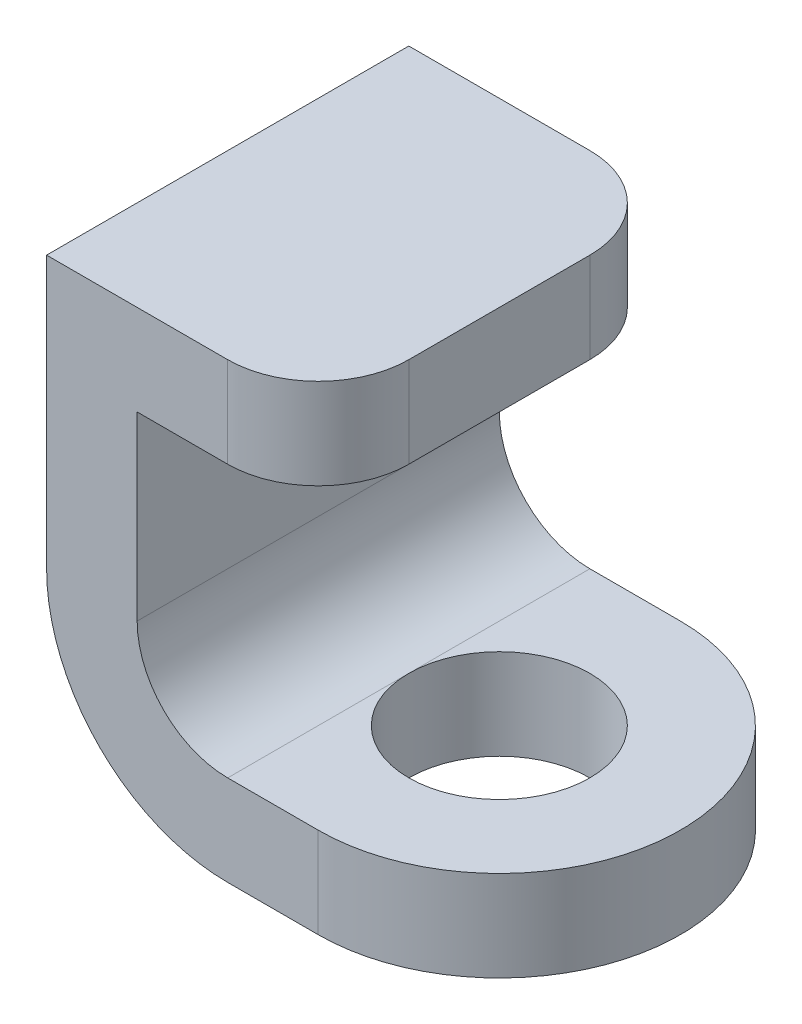
ISO-10303-21;
HEADER;
FILE_DESCRIPTION(('STEP AP214'),'2;1');
FILE_NAME('part.step','',(''),(''),'','','');
FILE_SCHEMA(('AUTOMOTIVE_DESIGN { 1 0 10303 214 1 1 1 1 }'));
ENDSEC;
DATA;
#1=APPLICATION_CONTEXT('core data for automotive mechanical design processes');
#2=APPLICATION_PROTOCOL_DEFINITION('international standard','automotive_design',2000,#1);
#3=PRODUCT_CONTEXT('',#1,'mechanical');
#4=PRODUCT('Part','Part','',(#3));
#5=PRODUCT_RELATED_PRODUCT_CATEGORY('part','',(#4));
#6=PRODUCT_DEFINITION_FORMATION('','',#4);
#7=PRODUCT_DEFINITION_CONTEXT('part definition',#1,'design');
#8=PRODUCT_DEFINITION('design','',#6,#7);
#9=PRODUCT_DEFINITION_SHAPE('','',#8);
#10=(LENGTH_UNIT() NAMED_UNIT(*) SI_UNIT(.MILLI.,.METRE.));
#11=(NAMED_UNIT(*) PLANE_ANGLE_UNIT() SI_UNIT($,.RADIAN.));
#12=(NAMED_UNIT(*) SI_UNIT($,.STERADIAN.) SOLID_ANGLE_UNIT());
#13=UNCERTAINTY_MEASURE_WITH_UNIT(LENGTH_MEASURE(1.E-05),#10,'distance_accuracy_value','');
#14=(GEOMETRIC_REPRESENTATION_CONTEXT(3) GLOBAL_UNCERTAINTY_ASSIGNED_CONTEXT((#13)) GLOBAL_UNIT_ASSIGNED_CONTEXT((#10,
#11,#12)) REPRESENTATION_CONTEXT('',''));
#15=CARTESIAN_POINT('',(0.,0.,0.));
#16=DIRECTION('',(0.,0.,1.));
#17=DIRECTION('',(1.,0.,0.));
#18=AXIS2_PLACEMENT_3D('',#15,#16,#17);
#19=CARTESIAN_POINT('',(-7.53303964757696,-21.1453744493392,40.));
#20=DIRECTION('',(0.,1.,0.));
#21=DIRECTION('',(0.,0.,1.));
#22=AXIS2_PLACEMENT_3D('',#19,#20,#21);
#23=PLANE('',#22);
#24=CARTESIAN_POINT('',(2.46696035242291,-21.1453744493392,20.));
#25=DIRECTION('',(0.,-1.,0.));
#26=DIRECTION('',(0.,0.,-1.));
#27=AXIS2_PLACEMENT_3D('',#24,#25,#26);
#28=CIRCLE('',#27,20.);
#29=CARTESIAN_POINT('',(2.46696035242291,-21.1453744493392,0.));
#30=VERTEX_POINT('',#29);
#31=CARTESIAN_POINT('',(2.46696035242291,-21.1453744493392,40.));
#32=VERTEX_POINT('',#31);
#33=EDGE_CURVE('E135',#30,#32,#28,.T.);
#34=ORIENTED_EDGE('',*,*,#33,.T.);
#35=DIRECTION('',(1.,0.,0.));
#36=VECTOR('',#35,1.);
#37=CARTESIAN_POINT('',(-7.53303964757696,-21.1453744493392,40.));
#38=LINE('',#37,#36);
#39=CARTESIAN_POINT('',(-7.53303964757695,-21.1453744493392,40.));
#40=VERTEX_POINT('',#39);
#41=EDGE_CURVE('E139',#40,#32,#38,.T.);
#42=ORIENTED_EDGE('',*,*,#41,.F.);
#43=DIRECTION('',(0.,0.,-1.));
#44=VECTOR('',#43,1.);
#45=CARTESIAN_POINT('',(-7.53303964757695,-21.1453744493392,40.));
#46=LINE('',#45,#44);
#47=CARTESIAN_POINT('',(-7.53303964757695,-21.1453744493392,20.));
#48=VERTEX_POINT('',#47);
#49=EDGE_CURVE('E224',#40,#48,#46,.T.);
#50=ORIENTED_EDGE('',*,*,#49,.T.);
#51=CARTESIAN_POINT('',(2.46696035242291,-21.1453744493392,20.));
#52=DIRECTION('',(0.,-1.,0.));
#53=DIRECTION('',(0.,0.,-1.));
#54=AXIS2_PLACEMENT_3D('',#51,#52,#53);
#55=CIRCLE('',#54,10.);
#56=EDGE_CURVE('E55',#48,#48,#55,.T.);
#57=ORIENTED_EDGE('',*,*,#56,.F.);
#58=CARTESIAN_POINT('',(-7.53303964757695,-21.1453744493392,0.));
#59=VERTEX_POINT('',#58);
#60=EDGE_CURVE('E223',#48,#59,#46,.T.);
#61=ORIENTED_EDGE('',*,*,#60,.T.);
#62=DIRECTION('',(1.,0.,0.));
#63=VECTOR('',#62,1.);
#64=CARTESIAN_POINT('',(-7.53303964757696,-21.1453744493392,0.));
#65=LINE('',#64,#63);
#66=EDGE_CURVE('E141',#59,#30,#65,.T.);
#67=ORIENTED_EDGE('',*,*,#66,.T.);
#68=EDGE_LOOP('',(#34,#42,#50,#57,#61,#67));
#69=FACE_BOUND('',#68,.T.);
#70=ADVANCED_FACE('F41',(#69),#23,.F.);
#71=CARTESIAN_POINT('',(22.4669603524229,-11.1453744493392,40.));
#72=DIRECTION('',(0.,-1.,0.));
#73=DIRECTION('',(1.,0.,0.));
#74=AXIS2_PLACEMENT_3D('',#71,#72,#73);
#75=PLANE('',#74);
#76=DIRECTION('',(-1.,0.,0.));
#77=VECTOR('',#76,1.);
#78=CARTESIAN_POINT('',(22.4669603524229,-11.1453744493392,40.));
#79=LINE('',#78,#77);
#80=CARTESIAN_POINT('',(2.46696035242291,-11.1453744493392,40.));
#81=VERTEX_POINT('',#80);
#82=CARTESIAN_POINT('',(-7.53303964757703,-11.1453744493392,40.));
#83=VERTEX_POINT('',#82);
#84=EDGE_CURVE('E159',#81,#83,#79,.T.);
#85=ORIENTED_EDGE('',*,*,#84,.F.);
#86=CARTESIAN_POINT('',(2.46696035242291,-11.1453744493392,20.));
#87=DIRECTION('',(0.,-1.,0.));
#88=DIRECTION('',(1.,0.,0.));
#89=AXIS2_PLACEMENT_3D('',#86,#87,#88);
#90=CIRCLE('',#89,20.);
#91=CARTESIAN_POINT('',(2.46696035242291,-11.1453744493392,0.));
#92=VERTEX_POINT('',#91);
#93=EDGE_CURVE('E149',#92,#81,#90,.T.);
#94=ORIENTED_EDGE('',*,*,#93,.F.);
#95=DIRECTION('',(-1.,0.,0.));
#96=VECTOR('',#95,1.);
#97=CARTESIAN_POINT('',(22.4669603524229,-11.1453744493392,0.));
#98=LINE('',#97,#96);
#99=CARTESIAN_POINT('',(-7.53303964757703,-11.1453744493392,0.));
#100=VERTEX_POINT('',#99);
#101=EDGE_CURVE('E192',#92,#100,#98,.T.);
#102=ORIENTED_EDGE('',*,*,#101,.T.);
#103=DIRECTION('',(0.,0.,-1.));
#104=VECTOR('',#103,1.);
#105=CARTESIAN_POINT('',(-7.53303964757703,-11.1453744493392,40.));
#106=LINE('',#105,#104);
#107=CARTESIAN_POINT('',(-7.53303964757703,-11.1453744493392,20.));
#108=VERTEX_POINT('',#107);
#109=EDGE_CURVE('E218',#108,#100,#106,.T.);
#110=ORIENTED_EDGE('',*,*,#109,.F.);
#111=CARTESIAN_POINT('',(2.46696035242291,-11.1453744493392,20.));
#112=DIRECTION('',(0.,-1.,0.));
#113=DIRECTION('',(1.,0.,0.));
#114=AXIS2_PLACEMENT_3D('',#111,#112,#113);
#115=CIRCLE('',#114,10.);
#116=EDGE_CURVE('E60',#108,#108,#115,.T.);
#117=ORIENTED_EDGE('',*,*,#116,.T.);
#118=EDGE_CURVE('E219',#83,#108,#106,.T.);
#119=ORIENTED_EDGE('',*,*,#118,.F.);
#120=EDGE_LOOP('',(#85,#94,#102,#110,#117,#119));
#121=FACE_BOUND('',#120,.T.);
#122=ADVANCED_FACE('F284',(#121),#75,.F.);
#123=CARTESIAN_POINT('',(-7.5330396475771,-1.14537444933921,40.));
#124=DIRECTION('',(0.,0.,-1.));
#125=DIRECTION('',(-1.,0.,0.));
#126=AXIS2_PLACEMENT_3D('',#123,#124,#125);
#127=PLANE('',#126);
#128=DIRECTION('',(0.,1.,0.));
#129=VECTOR('',#128,1.);
#130=CARTESIAN_POINT('',(-17.5330396475771,-1.14537444933914,40.));
#131=LINE('',#130,#129);
#132=CARTESIAN_POINT('',(-17.5330396475771,-1.14537444933921,40.));
#133=VERTEX_POINT('',#132);
#134=CARTESIAN_POINT('',(-17.5330396475771,18.8546255506608,40.));
#135=VERTEX_POINT('',#134);
#136=EDGE_CURVE('E171',#133,#135,#131,.T.);
#137=ORIENTED_EDGE('',*,*,#136,.T.);
#138=DIRECTION('',(1.,0.,0.));
#139=VECTOR('',#138,1.);
#140=CARTESIAN_POINT('',(-17.5330396475771,18.8546255506608,40.));
#141=LINE('',#140,#139);
#142=CARTESIAN_POINT('',(-7.53303964757718,18.8546255506608,40.));
#143=VERTEX_POINT('',#142);
#144=EDGE_CURVE('E174',#135,#143,#141,.T.);
#145=ORIENTED_EDGE('',*,*,#144,.T.);
#146=DIRECTION('',(0.,1.,0.));
#147=VECTOR('',#146,1.);
#148=CARTESIAN_POINT('',(-7.5330396475771,-11.1453744493392,40.));
#149=LINE('',#148,#147);
#150=CARTESIAN_POINT('',(-7.5330396475771,28.8546255506608,40.));
#151=VERTEX_POINT('',#150);
#152=EDGE_CURVE('E50',#143,#151,#149,.T.);
#153=ORIENTED_EDGE('',*,*,#152,.T.);
#154=DIRECTION('',(-1.,0.,0.));
#155=VECTOR('',#154,1.);
#156=CARTESIAN_POINT('',(2.46696035242289,28.8546255506608,40.));
#157=LINE('',#156,#155);
#158=CARTESIAN_POINT('',(-27.5330396475771,28.8546255506608,40.));
#159=VERTEX_POINT('',#158);
#160=EDGE_CURVE('E206',#151,#159,#157,.T.);
#161=ORIENTED_EDGE('',*,*,#160,.T.);
#162=DIRECTION('',(0.,-1.,0.));
#163=VECTOR('',#162,1.);
#164=CARTESIAN_POINT('',(-27.5330396475771,28.8546255506608,40.));
#165=LINE('',#164,#163);
#166=CARTESIAN_POINT('',(-27.5330396475771,-1.14537444933907,40.));
#167=VERTEX_POINT('',#166);
#168=EDGE_CURVE('E165',#159,#167,#165,.T.);
#169=ORIENTED_EDGE('',*,*,#168,.T.);
#170=CARTESIAN_POINT('',(-7.5330396475771,-1.14537444933921,40.));
#171=DIRECTION('',(0.,0.,1.));
#172=DIRECTION('',(-1.,0.,0.));
#173=AXIS2_PLACEMENT_3D('',#170,#171,#172);
#174=CIRCLE('',#173,20.);
#175=EDGE_CURVE('E156',#167,#40,#174,.T.);
#176=ORIENTED_EDGE('',*,*,#175,.T.);
#177=ORIENTED_EDGE('',*,*,#41,.T.);
#178=DIRECTION('',(0.,-1.,0.));
#179=VECTOR('',#178,1.);
#180=CARTESIAN_POINT('',(2.46696035242291,18.8546255506608,40.));
#181=LINE('',#180,#179);
#182=EDGE_CURVE('E144',#81,#32,#181,.T.);
#183=ORIENTED_EDGE('',*,*,#182,.F.);
#184=ORIENTED_EDGE('',*,*,#84,.T.);
#185=CARTESIAN_POINT('',(-7.5330396475771,-1.14537444933921,40.));
#186=DIRECTION('',(0.,0.,-1.));
#187=DIRECTION('',(-1.,0.,0.));
#188=AXIS2_PLACEMENT_3D('',#185,#186,#187);
#189=CIRCLE('',#188,10.);
#190=EDGE_CURVE('E163',#83,#133,#189,.T.);
#191=ORIENTED_EDGE('',*,*,#190,.T.);
#192=EDGE_LOOP('',(#137,#145,#153,#161,#169,#176,#177,#183,#184,#191));
#193=FACE_BOUND('',#192,.T.);
#194=ADVANCED_FACE('F154',(#193),#127,.F.);
#195=CARTESIAN_POINT('',(-7.5330396475771,-1.14537444933921,0.));
#196=DIRECTION('',(0.,0.,-1.));
#197=DIRECTION('',(-1.,0.,0.));
#198=AXIS2_PLACEMENT_3D('',#195,#196,#197);
#199=PLANE('',#198);
#200=CARTESIAN_POINT('',(-7.5330396475771,-1.14537444933921,0.));
#201=DIRECTION('',(0.,0.,1.));
#202=DIRECTION('',(-1.,0.,0.));
#203=AXIS2_PLACEMENT_3D('',#200,#201,#202);
#204=CIRCLE('',#203,20.);
#205=CARTESIAN_POINT('',(-27.5330396475771,-1.14537444933907,0.));
#206=VERTEX_POINT('',#205);
#207=EDGE_CURVE('E186',#206,#59,#204,.T.);
#208=ORIENTED_EDGE('',*,*,#207,.F.);
#209=DIRECTION('',(0.,-1.,0.));
#210=VECTOR('',#209,1.);
#211=CARTESIAN_POINT('',(-27.5330396475771,28.8546255506608,0.));
#212=LINE('',#211,#210);
#213=CARTESIAN_POINT('',(-27.5330396475771,28.8546255506608,0.));
#214=VERTEX_POINT('',#213);
#215=EDGE_CURVE('E182',#214,#206,#212,.T.);
#216=ORIENTED_EDGE('',*,*,#215,.F.);
#217=DIRECTION('',(-1.,0.,0.));
#218=VECTOR('',#217,1.);
#219=CARTESIAN_POINT('',(2.46696035242289,28.8546255506608,0.));
#220=LINE('',#219,#218);
#221=CARTESIAN_POINT('',(-7.53303964757717,28.8546255506608,0.));
#222=VERTEX_POINT('',#221);
#223=EDGE_CURVE('E179',#222,#214,#220,.T.);
#224=ORIENTED_EDGE('',*,*,#223,.F.);
#225=DIRECTION('',(0.,1.,0.));
#226=VECTOR('',#225,1.);
#227=CARTESIAN_POINT('',(-7.5330396475771,-11.1453744493392,0.));
#228=LINE('',#227,#226);
#229=CARTESIAN_POINT('',(-7.5330396475771,18.8546255506608,0.));
#230=VERTEX_POINT('',#229);
#231=EDGE_CURVE('E239',#230,#222,#228,.T.);
#232=ORIENTED_EDGE('',*,*,#231,.F.);
#233=DIRECTION('',(1.,0.,0.));
#234=VECTOR('',#233,1.);
#235=CARTESIAN_POINT('',(-17.5330396475771,18.8546255506608,0.));
#236=LINE('',#235,#234);
#237=CARTESIAN_POINT('',(-17.5330396475771,18.8546255506608,0.));
#238=VERTEX_POINT('',#237);
#239=EDGE_CURVE('E202',#238,#230,#236,.T.);
#240=ORIENTED_EDGE('',*,*,#239,.F.);
#241=DIRECTION('',(0.,1.,0.));
#242=VECTOR('',#241,1.);
#243=CARTESIAN_POINT('',(-17.5330396475771,-1.14537444933914,0.));
#244=LINE('',#243,#242);
#245=CARTESIAN_POINT('',(-17.5330396475771,-1.14537444933921,0.));
#246=VERTEX_POINT('',#245);
#247=EDGE_CURVE('E199',#246,#238,#244,.T.);
#248=ORIENTED_EDGE('',*,*,#247,.F.);
#249=CARTESIAN_POINT('',(-7.5330396475771,-1.14537444933921,0.));
#250=DIRECTION('',(0.,0.,-1.));
#251=DIRECTION('',(-1.,0.,0.));
#252=AXIS2_PLACEMENT_3D('',#249,#250,#251);
#253=CIRCLE('',#252,10.);
#254=EDGE_CURVE('E196',#100,#246,#253,.T.);
#255=ORIENTED_EDGE('',*,*,#254,.F.);
#256=ORIENTED_EDGE('',*,*,#101,.F.);
#257=DIRECTION('',(0.,-1.,0.));
#258=VECTOR('',#257,1.);
#259=CARTESIAN_POINT('',(2.46696035242291,18.8546255506608,0.));
#260=LINE('',#259,#258);
#261=EDGE_CURVE('E12',#92,#30,#260,.T.);
#262=ORIENTED_EDGE('',*,*,#261,.T.);
#263=ORIENTED_EDGE('',*,*,#66,.F.);
#264=EDGE_LOOP('',(#208,#216,#224,#232,#240,#248,#255,#256,#262,#263));
#265=FACE_BOUND('',#264,.T.);
#266=ADVANCED_FACE('F296',(#265),#199,.T.);
#267=CARTESIAN_POINT('',(2.46696035242289,18.8546255506608,40.));
#268=DIRECTION('',(-1.,0.,0.));
#269=DIRECTION('',(0.,0.,1.));
#270=AXIS2_PLACEMENT_3D('',#267,#268,#269);
#271=PLANE('',#270);
#272=DIRECTION('',(0.,0.,-1.));
#273=VECTOR('',#272,1.);
#274=CARTESIAN_POINT('',(2.46696035242289,18.8546255506608,40.));
#275=LINE('',#274,#273);
#276=CARTESIAN_POINT('',(2.4669603524229,18.8546255506608,29.9999999999999));
#277=VERTEX_POINT('',#276);
#278=CARTESIAN_POINT('',(2.4669603524229,18.8546255506608,10.0000000000001));
#279=VERTEX_POINT('',#278);
#280=EDGE_CURVE('E178',#277,#279,#275,.T.);
#281=ORIENTED_EDGE('',*,*,#280,.T.);
#282=DIRECTION('',(0.,1.,0.));
#283=VECTOR('',#282,1.);
#284=CARTESIAN_POINT('',(2.4669603524229,-11.1453744493392,10.0000000000001));
#285=LINE('',#284,#283);
#286=CARTESIAN_POINT('',(2.46696035242289,28.8546255506608,10.0000000000001));
#287=VERTEX_POINT('',#286);
#288=EDGE_CURVE('E264',#279,#287,#285,.T.);
#289=ORIENTED_EDGE('',*,*,#288,.T.);
#290=DIRECTION('',(0.,0.,-1.));
#291=VECTOR('',#290,1.);
#292=CARTESIAN_POINT('',(2.46696035242289,28.8546255506608,40.));
#293=LINE('',#292,#291);
#294=CARTESIAN_POINT('',(2.46696035242289,28.8546255506608,29.9999999999999));
#295=VERTEX_POINT('',#294);
#296=EDGE_CURVE('E235',#295,#287,#293,.T.);
#297=ORIENTED_EDGE('',*,*,#296,.F.);
#298=DIRECTION('',(0.,1.,0.));
#299=VECTOR('',#298,1.);
#300=CARTESIAN_POINT('',(2.4669603524229,-11.1453744493392,29.9999999999999));
#301=LINE('',#300,#299);
#302=EDGE_CURVE('E265',#277,#295,#301,.T.);
#303=ORIENTED_EDGE('',*,*,#302,.F.);
#304=EDGE_LOOP('',(#281,#289,#297,#303));
#305=FACE_BOUND('',#304,.T.);
#306=ADVANCED_FACE('F43',(#305),#271,.F.);
#307=CARTESIAN_POINT('',(2.46696035242289,28.8546255506608,40.));
#308=DIRECTION('',(0.,-1.,0.));
#309=DIRECTION('',(1.,0.,0.));
#310=AXIS2_PLACEMENT_3D('',#307,#308,#309);
#311=PLANE('',#310);
#312=CARTESIAN_POINT('',(-7.5330396475771,28.8546255506608,10.));
#313=DIRECTION('',(0.,1.,0.));
#314=DIRECTION('',(-1.,0.,0.));
#315=AXIS2_PLACEMENT_3D('',#312,#313,#314);
#316=CIRCLE('',#315,10.);
#317=EDGE_CURVE('E268',#287,#222,#316,.T.);
#318=ORIENTED_EDGE('',*,*,#317,.T.);
#319=ORIENTED_EDGE('',*,*,#223,.T.);
#320=DIRECTION('',(0.,0.,-1.));
#321=VECTOR('',#320,1.);
#322=CARTESIAN_POINT('',(-27.5330396475771,28.8546255506608,40.));
#323=LINE('',#322,#321);
#324=EDGE_CURVE('E231',#159,#214,#323,.T.);
#325=ORIENTED_EDGE('',*,*,#324,.F.);
#326=ORIENTED_EDGE('',*,*,#160,.F.);
#327=CARTESIAN_POINT('',(-7.5330396475771,28.8546255506608,30.));
#328=DIRECTION('',(0.,1.,0.));
#329=DIRECTION('',(-1.,0.,0.));
#330=AXIS2_PLACEMENT_3D('',#327,#328,#329);
#331=CIRCLE('',#330,10.);
#332=EDGE_CURVE('E252',#151,#295,#331,.T.);
#333=ORIENTED_EDGE('',*,*,#332,.T.);
#334=ORIENTED_EDGE('',*,*,#296,.T.);
#335=EDGE_LOOP('',(#318,#319,#325,#326,#333,#334));
#336=FACE_BOUND('',#335,.T.);
#337=ADVANCED_FACE('F251',(#336),#311,.F.);
#338=CARTESIAN_POINT('',(-17.5330396475771,18.8546255506608,40.));
#339=DIRECTION('',(0.,1.,0.));
#340=DIRECTION('',(0.,0.,1.));
#341=AXIS2_PLACEMENT_3D('',#338,#339,#340);
#342=PLANE('',#341);
#343=CARTESIAN_POINT('',(-7.5330396475771,18.8546255506608,10.));
#344=DIRECTION('',(0.,1.,0.));
#345=DIRECTION('',(0.,0.,1.));
#346=AXIS2_PLACEMENT_3D('',#343,#344,#345);
#347=CIRCLE('',#346,10.);
#348=EDGE_CURVE('E261',#279,#230,#347,.T.);
#349=ORIENTED_EDGE('',*,*,#348,.F.);
#350=ORIENTED_EDGE('',*,*,#280,.F.);
#351=CARTESIAN_POINT('',(-7.5330396475771,18.8546255506608,30.));
#352=DIRECTION('',(0.,1.,0.));
#353=DIRECTION('',(0.,0.,1.));
#354=AXIS2_PLACEMENT_3D('',#351,#352,#353);
#355=CIRCLE('',#354,10.);
#356=EDGE_CURVE('E183',#143,#277,#355,.T.);
#357=ORIENTED_EDGE('',*,*,#356,.F.);
#358=ORIENTED_EDGE('',*,*,#144,.F.);
#359=DIRECTION('',(0.,0.,-1.));
#360=VECTOR('',#359,1.);
#361=CARTESIAN_POINT('',(-17.5330396475771,18.8546255506608,40.));
#362=LINE('',#361,#360);
#363=EDGE_CURVE('E210',#135,#238,#362,.T.);
#364=ORIENTED_EDGE('',*,*,#363,.T.);
#365=ORIENTED_EDGE('',*,*,#239,.T.);
#366=EDGE_LOOP('',(#349,#350,#357,#358,#364,#365));
#367=FACE_BOUND('',#366,.T.);
#368=ADVANCED_FACE('F303',(#367),#342,.F.);
#369=CARTESIAN_POINT('',(-27.5330396475771,28.8546255506608,40.));
#370=DIRECTION('',(1.,0.,0.));
#371=DIRECTION('',(0.,1.,0.));
#372=AXIS2_PLACEMENT_3D('',#369,#370,#371);
#373=PLANE('',#372);
#374=DIRECTION('',(0.,0.,-1.));
#375=VECTOR('',#374,1.);
#376=CARTESIAN_POINT('',(-27.5330396475771,-1.14537444933907,40.));
#377=LINE('',#376,#375);
#378=EDGE_CURVE('E227',#167,#206,#377,.T.);
#379=ORIENTED_EDGE('',*,*,#378,.F.);
#380=ORIENTED_EDGE('',*,*,#168,.F.);
#381=ORIENTED_EDGE('',*,*,#324,.T.);
#382=ORIENTED_EDGE('',*,*,#215,.T.);
#383=EDGE_LOOP('',(#379,#380,#381,#382));
#384=FACE_BOUND('',#383,.T.);
#385=ADVANCED_FACE('F314',(#384),#373,.F.);
#386=CARTESIAN_POINT('',(-7.5330396475771,-1.14537444933921,40.));
#387=DIRECTION('',(0.,0.,-1.));
#388=DIRECTION('',(-1.,0.,0.));
#389=AXIS2_PLACEMENT_3D('',#386,#387,#388);
#390=CYLINDRICAL_SURFACE('',#389,20.);
#391=ORIENTED_EDGE('',*,*,#207,.T.);
#392=ORIENTED_EDGE('',*,*,#60,.F.);
#393=ORIENTED_EDGE('',*,*,#49,.F.);
#394=ORIENTED_EDGE('',*,*,#175,.F.);
#395=ORIENTED_EDGE('',*,*,#378,.T.);
#396=EDGE_LOOP('',(#391,#392,#393,#394,#395));
#397=FACE_BOUND('',#396,.T.);
#398=ADVANCED_FACE('F316',(#397),#390,.T.);
#399=CARTESIAN_POINT('',(-7.5330396475771,-1.14537444933921,40.));
#400=DIRECTION('',(0.,0.,-1.));
#401=DIRECTION('',(-1.,0.,0.));
#402=AXIS2_PLACEMENT_3D('',#399,#400,#401);
#403=CYLINDRICAL_SURFACE('',#402,10.);
#404=ORIENTED_EDGE('',*,*,#254,.T.);
#405=DIRECTION('',(0.,0.,-1.));
#406=VECTOR('',#405,1.);
#407=CARTESIAN_POINT('',(-17.5330396475771,-1.14537444933921,40.));
#408=LINE('',#407,#406);
#409=EDGE_CURVE('E214',#133,#246,#408,.T.);
#410=ORIENTED_EDGE('',*,*,#409,.F.);
#411=ORIENTED_EDGE('',*,*,#190,.F.);
#412=ORIENTED_EDGE('',*,*,#118,.T.);
#413=ORIENTED_EDGE('',*,*,#109,.T.);
#414=EDGE_LOOP('',(#404,#410,#411,#412,#413));
#415=FACE_BOUND('',#414,.T.);
#416=ADVANCED_FACE('F290',(#415),#403,.F.);
#417=CARTESIAN_POINT('',(-17.5330396475771,-1.14537444933914,40.));
#418=DIRECTION('',(-1.,0.,0.));
#419=DIRECTION('',(0.,0.,1.));
#420=AXIS2_PLACEMENT_3D('',#417,#418,#419);
#421=PLANE('',#420);
#422=ORIENTED_EDGE('',*,*,#247,.T.);
#423=ORIENTED_EDGE('',*,*,#363,.F.);
#424=ORIENTED_EDGE('',*,*,#136,.F.);
#425=ORIENTED_EDGE('',*,*,#409,.T.);
#426=EDGE_LOOP('',(#422,#423,#424,#425));
#427=FACE_BOUND('',#426,.T.);
#428=ADVANCED_FACE('F300',(#427),#421,.F.);
#429=CARTESIAN_POINT('',(-7.5330396475771,-11.1453744493392,10.));
#430=DIRECTION('',(0.,1.,0.));
#431=DIRECTION('',(-1.,0.,0.));
#432=AXIS2_PLACEMENT_3D('',#429,#430,#431);
#433=CYLINDRICAL_SURFACE('',#432,10.);
#434=ORIENTED_EDGE('',*,*,#348,.T.);
#435=ORIENTED_EDGE('',*,*,#231,.T.);
#436=ORIENTED_EDGE('',*,*,#317,.F.);
#437=ORIENTED_EDGE('',*,*,#288,.F.);
#438=EDGE_LOOP('',(#434,#435,#436,#437));
#439=FACE_BOUND('',#438,.T.);
#440=ADVANCED_FACE('F336',(#439),#433,.T.);
#441=CARTESIAN_POINT('',(-7.5330396475771,-11.1453744493392,30.));
#442=DIRECTION('',(0.,1.,0.));
#443=DIRECTION('',(-1.,0.,0.));
#444=AXIS2_PLACEMENT_3D('',#441,#442,#443);
#445=CYLINDRICAL_SURFACE('',#444,10.);
#446=ORIENTED_EDGE('',*,*,#356,.T.);
#447=ORIENTED_EDGE('',*,*,#302,.T.);
#448=ORIENTED_EDGE('',*,*,#332,.F.);
#449=ORIENTED_EDGE('',*,*,#152,.F.);
#450=EDGE_LOOP('',(#446,#447,#448,#449));
#451=FACE_BOUND('',#450,.T.);
#452=ADVANCED_FACE('F306',(#451),#445,.T.);
#453=CARTESIAN_POINT('',(2.46696035242291,18.8546255506608,20.));
#454=DIRECTION('',(0.,-1.,0.));
#455=DIRECTION('',(0.,0.,-1.));
#456=AXIS2_PLACEMENT_3D('',#453,#454,#455);
#457=CYLINDRICAL_SURFACE('',#456,20.);
#458=ORIENTED_EDGE('',*,*,#93,.T.);
#459=ORIENTED_EDGE('',*,*,#182,.T.);
#460=ORIENTED_EDGE('',*,*,#33,.F.);
#461=ORIENTED_EDGE('',*,*,#261,.F.);
#462=EDGE_LOOP('',(#458,#459,#460,#461));
#463=FACE_BOUND('',#462,.T.);
#464=ADVANCED_FACE('F147',(#463),#457,.T.);
#465=CARTESIAN_POINT('',(2.46696035242291,18.8546255506608,20.));
#466=DIRECTION('',(0.,-1.,0.));
#467=DIRECTION('',(0.,0.,-1.));
#468=AXIS2_PLACEMENT_3D('',#465,#466,#467);
#469=CYLINDRICAL_SURFACE('',#468,10.);
#470=ORIENTED_EDGE('',*,*,#56,.T.);
#471=EDGE_LOOP('',(#470));
#472=FACE_BOUND('',#471,.T.);
#473=ORIENTED_EDGE('',*,*,#116,.F.);
#474=EDGE_LOOP('',(#473));
#475=FACE_BOUND('',#474,.T.);
#476=ADVANCED_FACE('F347',(#472,#475),#469,.F.);
#477=CLOSED_SHELL('',(#70,#122,#194,#266,#306,#337,#368,#385,#398,#416,#428,#440,#452,#464,#476));
#478=MANIFOLD_SOLID_BREP('B2',#477);
#479=ADVANCED_BREP_SHAPE_REPRESENTATION('',(#18,#478),#14);
#480=SHAPE_DEFINITION_REPRESENTATION(#9,#479);
ENDSEC;
END-ISO-10303-21;
